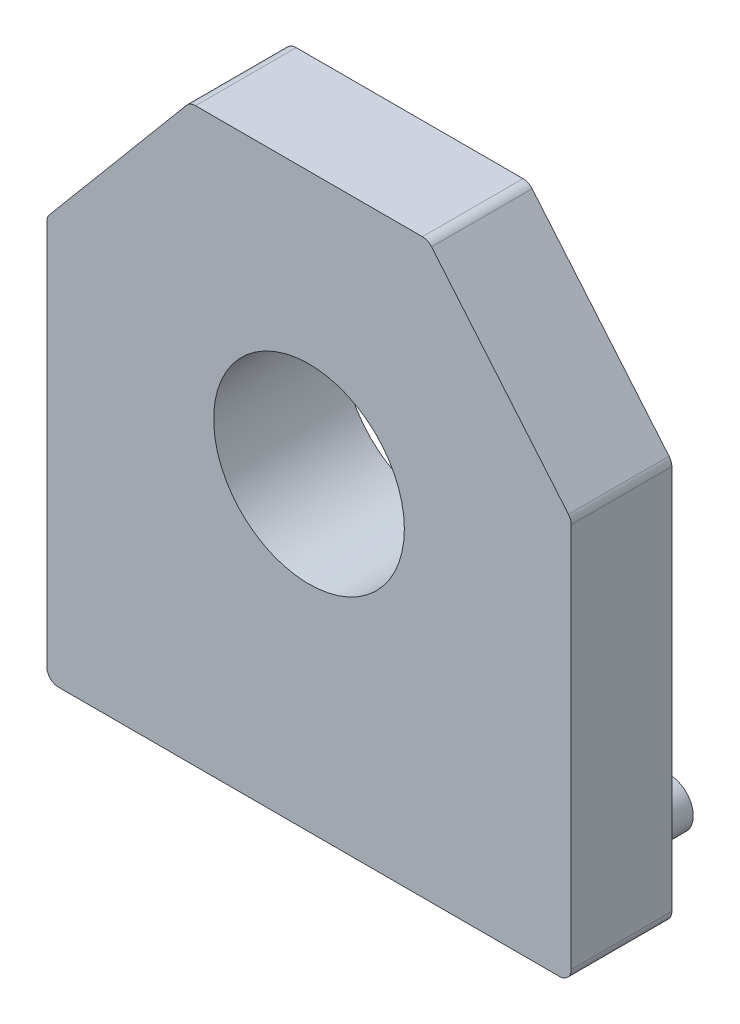
ISO-10303-21;
HEADER;
FILE_DESCRIPTION(('STEP AP214'),'2;1');
FILE_NAME('part.step','',(''),(''),'','','');
FILE_SCHEMA(('AUTOMOTIVE_DESIGN { 1 0 10303 214 1 1 1 1 }'));
ENDSEC;
DATA;
#1=APPLICATION_CONTEXT('core data for automotive mechanical design processes');
#2=APPLICATION_PROTOCOL_DEFINITION('international standard','automotive_design',2000,#1);
#3=PRODUCT_CONTEXT('',#1,'mechanical');
#4=PRODUCT('Part','Part','',(#3));
#5=PRODUCT_RELATED_PRODUCT_CATEGORY('part','',(#4));
#6=PRODUCT_DEFINITION_FORMATION('','',#4);
#7=PRODUCT_DEFINITION_CONTEXT('part definition',#1,'design');
#8=PRODUCT_DEFINITION('design','',#6,#7);
#9=PRODUCT_DEFINITION_SHAPE('','',#8);
#10=(LENGTH_UNIT() NAMED_UNIT(*) SI_UNIT(.MILLI.,.METRE.));
#11=(NAMED_UNIT(*) PLANE_ANGLE_UNIT() SI_UNIT($,.RADIAN.));
#12=(NAMED_UNIT(*) SI_UNIT($,.STERADIAN.) SOLID_ANGLE_UNIT());
#13=UNCERTAINTY_MEASURE_WITH_UNIT(LENGTH_MEASURE(1.E-05),#10,'distance_accuracy_value','');
#14=(GEOMETRIC_REPRESENTATION_CONTEXT(3) GLOBAL_UNCERTAINTY_ASSIGNED_CONTEXT((#13)) GLOBAL_UNIT_ASSIGNED_CONTEXT((#10,
#11,#12)) REPRESENTATION_CONTEXT('',''));
#15=CARTESIAN_POINT('',(0.,0.,0.));
#16=DIRECTION('',(0.,0.,1.));
#17=DIRECTION('',(1.,0.,0.));
#18=AXIS2_PLACEMENT_3D('',#15,#16,#17);
#19=CARTESIAN_POINT('',(0.,12.,0.));
#20=DIRECTION('',(0.,0.,-1.));
#21=DIRECTION('',(-1.,0.,0.));
#22=AXIS2_PLACEMENT_3D('',#19,#20,#21);
#23=PLANE('',#22);
#24=CARTESIAN_POINT('',(9.75,1.01,0.));
#25=DIRECTION('',(0.,0.,-1.));
#26=DIRECTION('',(-1.,0.,0.));
#27=AXIS2_PLACEMENT_3D('',#24,#25,#26);
#28=CIRCLE('',#27,0.500000000000001);
#29=CARTESIAN_POINT('',(9.25,1.01,0.));
#30=VERTEX_POINT('',#29);
#31=EDGE_CURVE('E248',#30,#30,#28,.T.);
#32=ORIENTED_EDGE('',*,*,#31,.F.);
#33=EDGE_LOOP('',(#32));
#34=FACE_BOUND('',#33,.T.);
#35=DIRECTION('',(1.,0.,0.));
#36=VECTOR('',#35,1.);
#37=CARTESIAN_POINT('',(0.,0.,0.));
#38=LINE('',#37,#36);
#39=CARTESIAN_POINT('',(0.25,0.,0.));
#40=VERTEX_POINT('',#39);
#41=CARTESIAN_POINT('',(10.75,0.,0.));
#42=VERTEX_POINT('',#41);
#43=EDGE_CURVE('E138',#40,#42,#38,.T.);
#44=ORIENTED_EDGE('',*,*,#43,.F.);
#45=CARTESIAN_POINT('',(0.25,0.25,0.));
#46=DIRECTION('',(0.,0.,-1.));
#47=DIRECTION('',(-1.,0.,0.));
#48=AXIS2_PLACEMENT_3D('',#45,#46,#47);
#49=CIRCLE('',#48,0.25);
#50=CARTESIAN_POINT('',(0.,0.25,0.));
#51=VERTEX_POINT('',#50);
#52=EDGE_CURVE('E121',#40,#51,#49,.T.);
#53=ORIENTED_EDGE('',*,*,#52,.T.);
#54=DIRECTION('',(0.,-1.,0.));
#55=VECTOR('',#54,1.);
#56=CARTESIAN_POINT('',(0.,0.,0.));
#57=LINE('',#56,#55);
#58=CARTESIAN_POINT('',(0.,8.32900744143345,0.));
#59=VERTEX_POINT('',#58);
#60=EDGE_CURVE('E149',#59,#51,#57,.T.);
#61=ORIENTED_EDGE('',*,*,#60,.F.);
#62=CARTESIAN_POINT('',(0.25,8.32900744143345,0.));
#63=DIRECTION('',(0.,0.,-1.));
#64=DIRECTION('',(-1.,0.,0.));
#65=AXIS2_PLACEMENT_3D('',#62,#63,#64);
#66=CIRCLE('',#65,0.25);
#67=CARTESIAN_POINT('',(0.0584888892202551,8.48970434385508,0.));
#68=VERTEX_POINT('',#67);
#69=EDGE_CURVE('E132',#59,#68,#66,.T.);
#70=ORIENTED_EDGE('',*,*,#69,.T.);
#71=DIRECTION('',(-0.64278760968654,-0.766044443118977,0.));
#72=VECTOR('',#71,1.);
#73=CARTESIAN_POINT('',(0.,8.42,0.));
#74=LINE('',#73,#72);
#75=CARTESIAN_POINT('',(2.92904248337368,11.9106969024216,0.));
#76=VERTEX_POINT('',#75);
#77=EDGE_CURVE('E163',#76,#68,#74,.T.);
#78=ORIENTED_EDGE('',*,*,#77,.F.);
#79=CARTESIAN_POINT('',(3.12055359415342,11.75,0.));
#80=DIRECTION('',(0.,0.,-1.));
#81=DIRECTION('',(-1.,0.,0.));
#82=AXIS2_PLACEMENT_3D('',#79,#80,#81);
#83=CIRCLE('',#82,0.25);
#84=CARTESIAN_POINT('',(3.12055359415342,12.,0.));
#85=VERTEX_POINT('',#84);
#86=EDGE_CURVE('E172',#76,#85,#83,.T.);
#87=ORIENTED_EDGE('',*,*,#86,.T.);
#88=DIRECTION('',(-1.,0.,0.));
#89=VECTOR('',#88,1.);
#90=CARTESIAN_POINT('',(3.00397667961467,12.,0.));
#91=LINE('',#90,#89);
#92=CARTESIAN_POINT('',(7.87944640584656,12.,0.));
#93=VERTEX_POINT('',#92);
#94=EDGE_CURVE('E160',#93,#85,#91,.T.);
#95=ORIENTED_EDGE('',*,*,#94,.F.);
#96=CARTESIAN_POINT('',(7.87944640584656,11.75,0.));
#97=DIRECTION('',(0.,0.,-1.));
#98=DIRECTION('',(-1.,0.,0.));
#99=AXIS2_PLACEMENT_3D('',#96,#97,#98);
#100=CIRCLE('',#99,0.25);
#101=CARTESIAN_POINT('',(8.07095751662631,11.9106969024216,0.));
#102=VERTEX_POINT('',#101);
#103=EDGE_CURVE('E142',#93,#102,#100,.T.);
#104=ORIENTED_EDGE('',*,*,#103,.T.);
#105=DIRECTION('',(-0.642787609686541,0.766044443118976,0.));
#106=VECTOR('',#105,1.);
#107=CARTESIAN_POINT('',(11.,8.42,0.));
#108=LINE('',#107,#106);
#109=CARTESIAN_POINT('',(10.9415111107797,8.48970434385508,0.));
#110=VERTEX_POINT('',#109);
#111=EDGE_CURVE('E152',#110,#102,#108,.T.);
#112=ORIENTED_EDGE('',*,*,#111,.F.);
#113=CARTESIAN_POINT('',(10.75,8.32900744143345,0.));
#114=DIRECTION('',(0.,0.,-1.));
#115=DIRECTION('',(-1.,0.,0.));
#116=AXIS2_PLACEMENT_3D('',#113,#114,#115);
#117=CIRCLE('',#116,0.25);
#118=CARTESIAN_POINT('',(11.,8.32900744143345,0.));
#119=VERTEX_POINT('',#118);
#120=EDGE_CURVE('E169',#110,#119,#117,.T.);
#121=ORIENTED_EDGE('',*,*,#120,.T.);
#122=DIRECTION('',(0.,1.,0.));
#123=VECTOR('',#122,1.);
#124=CARTESIAN_POINT('',(11.,0.,0.));
#125=LINE('',#124,#123);
#126=CARTESIAN_POINT('',(11.,0.25,0.));
#127=VERTEX_POINT('',#126);
#128=EDGE_CURVE('E148',#127,#119,#125,.T.);
#129=ORIENTED_EDGE('',*,*,#128,.F.);
#130=CARTESIAN_POINT('',(10.75,0.25,0.));
#131=DIRECTION('',(0.,0.,-1.));
#132=DIRECTION('',(-1.,0.,0.));
#133=AXIS2_PLACEMENT_3D('',#130,#131,#132);
#134=CIRCLE('',#133,0.25);
#135=EDGE_CURVE('E147',#127,#42,#134,.T.);
#136=ORIENTED_EDGE('',*,*,#135,.T.);
#137=EDGE_LOOP('',(#44,#53,#61,#70,#78,#87,#95,#104,#112,#121,#129,#136));
#138=FACE_BOUND('',#137,.T.);
#139=CARTESIAN_POINT('',(5.5,6.5,0.));
#140=DIRECTION('',(0.,0.,-1.));
#141=DIRECTION('',(-1.,0.,0.));
#142=AXIS2_PLACEMENT_3D('',#139,#140,#141);
#143=CIRCLE('',#142,2.5);
#144=CARTESIAN_POINT('',(3.,6.5,0.));
#145=VERTEX_POINT('',#144);
#146=EDGE_CURVE('E239',#145,#145,#143,.T.);
#147=ORIENTED_EDGE('',*,*,#146,.F.);
#148=EDGE_LOOP('',(#147));
#149=FACE_BOUND('',#148,.T.);
#150=CARTESIAN_POINT('',(1.25,1.01,0.));
#151=DIRECTION('',(0.,0.,-1.));
#152=DIRECTION('',(-1.,0.,0.));
#153=AXIS2_PLACEMENT_3D('',#150,#151,#152);
#154=CIRCLE('',#153,0.5);
#155=CARTESIAN_POINT('',(0.749999999999996,1.01,0.));
#156=VERTEX_POINT('',#155);
#157=EDGE_CURVE('E254',#156,#156,#154,.T.);
#158=ORIENTED_EDGE('',*,*,#157,.F.);
#159=EDGE_LOOP('',(#158));
#160=FACE_BOUND('',#159,.T.);
#161=ADVANCED_FACE('F30',(#34,#138,#149,#160),#23,.T.);
#162=CARTESIAN_POINT('',(0.,0.,2.11));
#163=DIRECTION('',(1.,0.,0.));
#164=DIRECTION('',(0.,0.,-1.));
#165=AXIS2_PLACEMENT_3D('',#162,#163,#164);
#166=PLANE('',#165);
#167=ORIENTED_EDGE('',*,*,#60,.T.);
#168=DIRECTION('',(0.,0.,-1.));
#169=VECTOR('',#168,1.);
#170=CARTESIAN_POINT('',(0.,0.25,2.11));
#171=LINE('',#170,#169);
#172=CARTESIAN_POINT('',(0.,0.25,2.11));
#173=VERTEX_POINT('',#172);
#174=EDGE_CURVE('E126',#51,#173,#171,.F.);
#175=ORIENTED_EDGE('',*,*,#174,.T.);
#176=DIRECTION('',(0.,-1.,0.));
#177=VECTOR('',#176,1.);
#178=CARTESIAN_POINT('',(0.,0.,2.11));
#179=LINE('',#178,#177);
#180=CARTESIAN_POINT('',(0.,8.32900744143345,2.11));
#181=VERTEX_POINT('',#180);
#182=EDGE_CURVE('E165',#181,#173,#179,.T.);
#183=ORIENTED_EDGE('',*,*,#182,.F.);
#184=DIRECTION('',(0.,0.,-1.));
#185=VECTOR('',#184,1.);
#186=CARTESIAN_POINT('',(0.,8.32900744143345,2.11));
#187=LINE('',#186,#185);
#188=EDGE_CURVE('E131',#181,#59,#187,.T.);
#189=ORIENTED_EDGE('',*,*,#188,.T.);
#190=EDGE_LOOP('',(#167,#175,#183,#189));
#191=FACE_BOUND('',#190,.T.);
#192=ADVANCED_FACE('F270',(#191),#166,.F.);
#193=CARTESIAN_POINT('',(0.,0.,2.11));
#194=DIRECTION('',(0.,1.,0.));
#195=DIRECTION('',(0.,0.,1.));
#196=AXIS2_PLACEMENT_3D('',#193,#194,#195);
#197=PLANE('',#196);
#198=DIRECTION('',(1.,0.,0.));
#199=VECTOR('',#198,1.);
#200=CARTESIAN_POINT('',(0.,0.,2.11));
#201=LINE('',#200,#199);
#202=CARTESIAN_POINT('',(0.25,0.,2.11));
#203=VERTEX_POINT('',#202);
#204=CARTESIAN_POINT('',(10.75,0.,2.11));
#205=VERTEX_POINT('',#204);
#206=EDGE_CURVE('E141',#203,#205,#201,.T.);
#207=ORIENTED_EDGE('',*,*,#206,.F.);
#208=DIRECTION('',(0.,0.,-1.));
#209=VECTOR('',#208,1.);
#210=CARTESIAN_POINT('',(0.25,0.,2.11));
#211=LINE('',#210,#209);
#212=EDGE_CURVE('E125',#203,#40,#211,.T.);
#213=ORIENTED_EDGE('',*,*,#212,.T.);
#214=ORIENTED_EDGE('',*,*,#43,.T.);
#215=DIRECTION('',(0.,0.,-1.));
#216=VECTOR('',#215,1.);
#217=CARTESIAN_POINT('',(10.75,0.,2.11));
#218=LINE('',#217,#216);
#219=EDGE_CURVE('E143',#42,#205,#218,.F.);
#220=ORIENTED_EDGE('',*,*,#219,.T.);
#221=EDGE_LOOP('',(#207,#213,#214,#220));
#222=FACE_BOUND('',#221,.T.);
#223=ADVANCED_FACE('F137',(#222),#197,.F.);
#224=CARTESIAN_POINT('',(11.,0.,2.11));
#225=DIRECTION('',(-1.,0.,0.));
#226=DIRECTION('',(0.,-1.,0.));
#227=AXIS2_PLACEMENT_3D('',#224,#225,#226);
#228=PLANE('',#227);
#229=DIRECTION('',(0.,1.,0.));
#230=VECTOR('',#229,1.);
#231=CARTESIAN_POINT('',(11.,0.,2.11));
#232=LINE('',#231,#230);
#233=CARTESIAN_POINT('',(11.,0.25,2.11));
#234=VERTEX_POINT('',#233);
#235=CARTESIAN_POINT('',(11.,8.32900744143345,2.11));
#236=VERTEX_POINT('',#235);
#237=EDGE_CURVE('E218',#234,#236,#232,.T.);
#238=ORIENTED_EDGE('',*,*,#237,.F.);
#239=DIRECTION('',(0.,0.,-1.));
#240=VECTOR('',#239,1.);
#241=CARTESIAN_POINT('',(11.,0.25,2.11));
#242=LINE('',#241,#240);
#243=EDGE_CURVE('E200',#234,#127,#242,.T.);
#244=ORIENTED_EDGE('',*,*,#243,.T.);
#245=ORIENTED_EDGE('',*,*,#128,.T.);
#246=DIRECTION('',(0.,0.,-1.));
#247=VECTOR('',#246,1.);
#248=CARTESIAN_POINT('',(11.,8.32900744143345,2.11));
#249=LINE('',#248,#247);
#250=EDGE_CURVE('E198',#119,#236,#249,.F.);
#251=ORIENTED_EDGE('',*,*,#250,.T.);
#252=EDGE_LOOP('',(#238,#244,#245,#251));
#253=FACE_BOUND('',#252,.T.);
#254=ADVANCED_FACE('F288',(#253),#228,.F.);
#255=CARTESIAN_POINT('',(11.,8.42,2.11));
#256=DIRECTION('',(-0.766044443118976,-0.642787609686542,0.));
#257=DIRECTION('',(0.642787609686542,-0.766044443118976,0.));
#258=AXIS2_PLACEMENT_3D('',#255,#256,#257);
#259=PLANE('',#258);
#260=DIRECTION('',(-0.642787609686541,0.766044443118976,0.));
#261=VECTOR('',#260,1.);
#262=CARTESIAN_POINT('',(11.,8.42,2.11));
#263=LINE('',#262,#261);
#264=CARTESIAN_POINT('',(10.9415111107797,8.48970434385508,2.11));
#265=VERTEX_POINT('',#264);
#266=CARTESIAN_POINT('',(8.07095751662631,11.9106969024216,2.11));
#267=VERTEX_POINT('',#266);
#268=EDGE_CURVE('E207',#265,#267,#263,.T.);
#269=ORIENTED_EDGE('',*,*,#268,.F.);
#270=DIRECTION('',(0.,0.,-1.));
#271=VECTOR('',#270,1.);
#272=CARTESIAN_POINT('',(10.9415111107797,8.48970434385508,2.11));
#273=LINE('',#272,#271);
#274=EDGE_CURVE('E11',#265,#110,#273,.T.);
#275=ORIENTED_EDGE('',*,*,#274,.T.);
#276=ORIENTED_EDGE('',*,*,#111,.T.);
#277=DIRECTION('',(0.,0.,-1.));
#278=VECTOR('',#277,1.);
#279=CARTESIAN_POINT('',(8.07095751662631,11.9106969024216,2.11));
#280=LINE('',#279,#278);
#281=EDGE_CURVE('E38',#102,#267,#280,.F.);
#282=ORIENTED_EDGE('',*,*,#281,.T.);
#283=EDGE_LOOP('',(#269,#275,#276,#282));
#284=FACE_BOUND('',#283,.T.);
#285=ADVANCED_FACE('F206',(#284),#259,.F.);
#286=CARTESIAN_POINT('',(3.00397667961467,12.,2.11));
#287=DIRECTION('',(0.,-1.,0.));
#288=DIRECTION('',(0.,0.,-1.));
#289=AXIS2_PLACEMENT_3D('',#286,#287,#288);
#290=PLANE('',#289);
#291=ORIENTED_EDGE('',*,*,#94,.T.);
#292=DIRECTION('',(0.,0.,-1.));
#293=VECTOR('',#292,1.);
#294=CARTESIAN_POINT('',(3.12055359415342,12.,2.11));
#295=LINE('',#294,#293);
#296=CARTESIAN_POINT('',(3.12055359415342,12.,2.11));
#297=VERTEX_POINT('',#296);
#298=EDGE_CURVE('E196',#85,#297,#295,.F.);
#299=ORIENTED_EDGE('',*,*,#298,.T.);
#300=DIRECTION('',(-1.,0.,0.));
#301=VECTOR('',#300,1.);
#302=CARTESIAN_POINT('',(3.00397667961467,12.,2.11));
#303=LINE('',#302,#301);
#304=CARTESIAN_POINT('',(7.87944640584656,12.,2.11));
#305=VERTEX_POINT('',#304);
#306=EDGE_CURVE('E217',#305,#297,#303,.T.);
#307=ORIENTED_EDGE('',*,*,#306,.F.);
#308=DIRECTION('',(0.,0.,-1.));
#309=VECTOR('',#308,1.);
#310=CARTESIAN_POINT('',(7.87944640584656,12.,2.11));
#311=LINE('',#310,#309);
#312=EDGE_CURVE('E193',#305,#93,#311,.T.);
#313=ORIENTED_EDGE('',*,*,#312,.T.);
#314=EDGE_LOOP('',(#291,#299,#307,#313));
#315=FACE_BOUND('',#314,.T.);
#316=ADVANCED_FACE('F223',(#315),#290,.F.);
#317=CARTESIAN_POINT('',(0.,8.42,2.11));
#318=DIRECTION('',(0.766044443118977,-0.64278760968654,0.));
#319=DIRECTION('',(0.64278760968654,0.766044443118977,0.));
#320=AXIS2_PLACEMENT_3D('',#317,#318,#319);
#321=PLANE('',#320);
#322=ORIENTED_EDGE('',*,*,#77,.T.);
#323=DIRECTION('',(0.,0.,-1.));
#324=VECTOR('',#323,1.);
#325=CARTESIAN_POINT('',(0.0584888892202551,8.48970434385508,2.11));
#326=LINE('',#325,#324);
#327=CARTESIAN_POINT('',(0.0584888892202551,8.48970434385508,2.11));
#328=VERTEX_POINT('',#327);
#329=EDGE_CURVE('E45',#68,#328,#326,.F.);
#330=ORIENTED_EDGE('',*,*,#329,.T.);
#331=DIRECTION('',(-0.64278760968654,-0.766044443118977,0.));
#332=VECTOR('',#331,1.);
#333=CARTESIAN_POINT('',(0.,8.42,2.11));
#334=LINE('',#333,#332);
#335=CARTESIAN_POINT('',(2.92904248337368,11.9106969024216,2.11));
#336=VERTEX_POINT('',#335);
#337=EDGE_CURVE('E166',#336,#328,#334,.T.);
#338=ORIENTED_EDGE('',*,*,#337,.F.);
#339=DIRECTION('',(0.,0.,-1.));
#340=VECTOR('',#339,1.);
#341=CARTESIAN_POINT('',(2.92904248337368,11.9106969024216,2.11));
#342=LINE('',#341,#340);
#343=EDGE_CURVE('E189',#336,#76,#342,.T.);
#344=ORIENTED_EDGE('',*,*,#343,.T.);
#345=EDGE_LOOP('',(#322,#330,#338,#344));
#346=FACE_BOUND('',#345,.T.);
#347=ADVANCED_FACE('F229',(#346),#321,.F.);
#348=CARTESIAN_POINT('',(0.,12.,2.11));
#349=DIRECTION('',(0.,0.,-1.));
#350=DIRECTION('',(-1.,0.,0.));
#351=AXIS2_PLACEMENT_3D('',#348,#349,#350);
#352=PLANE('',#351);
#353=CARTESIAN_POINT('',(5.5,6.5,2.11));
#354=DIRECTION('',(0.,0.,1.));
#355=DIRECTION('',(1.,0.,0.));
#356=AXIS2_PLACEMENT_3D('',#353,#354,#355);
#357=CIRCLE('',#356,2.);
#358=CARTESIAN_POINT('',(7.5,6.5,2.11));
#359=VERTEX_POINT('',#358);
#360=EDGE_CURVE('E154',#359,#359,#357,.T.);
#361=ORIENTED_EDGE('',*,*,#360,.F.);
#362=EDGE_LOOP('',(#361));
#363=FACE_BOUND('',#362,.T.);
#364=ORIENTED_EDGE('',*,*,#182,.T.);
#365=CARTESIAN_POINT('',(0.25,0.25,2.11));
#366=DIRECTION('',(0.,0.,-1.));
#367=DIRECTION('',(-1.,0.,0.));
#368=AXIS2_PLACEMENT_3D('',#365,#366,#367);
#369=CIRCLE('',#368,0.25);
#370=EDGE_CURVE('E187',#173,#203,#369,.F.);
#371=ORIENTED_EDGE('',*,*,#370,.T.);
#372=ORIENTED_EDGE('',*,*,#206,.T.);
#373=CARTESIAN_POINT('',(10.75,0.25,2.11));
#374=DIRECTION('',(0.,0.,-1.));
#375=DIRECTION('',(-1.,0.,0.));
#376=AXIS2_PLACEMENT_3D('',#373,#374,#375);
#377=CIRCLE('',#376,0.25);
#378=EDGE_CURVE('E182',#205,#234,#377,.F.);
#379=ORIENTED_EDGE('',*,*,#378,.T.);
#380=ORIENTED_EDGE('',*,*,#237,.T.);
#381=CARTESIAN_POINT('',(10.75,8.32900744143345,2.11));
#382=DIRECTION('',(0.,0.,-1.));
#383=DIRECTION('',(-1.,0.,0.));
#384=AXIS2_PLACEMENT_3D('',#381,#382,#383);
#385=CIRCLE('',#384,0.25);
#386=EDGE_CURVE('E180',#236,#265,#385,.F.);
#387=ORIENTED_EDGE('',*,*,#386,.T.);
#388=ORIENTED_EDGE('',*,*,#268,.T.);
#389=CARTESIAN_POINT('',(7.87944640584656,11.75,2.11));
#390=DIRECTION('',(0.,0.,-1.));
#391=DIRECTION('',(-1.,0.,0.));
#392=AXIS2_PLACEMENT_3D('',#389,#390,#391);
#393=CIRCLE('',#392,0.25);
#394=EDGE_CURVE('E178',#267,#305,#393,.F.);
#395=ORIENTED_EDGE('',*,*,#394,.T.);
#396=ORIENTED_EDGE('',*,*,#306,.T.);
#397=CARTESIAN_POINT('',(3.12055359415342,11.75,2.11));
#398=DIRECTION('',(0.,0.,-1.));
#399=DIRECTION('',(-1.,0.,0.));
#400=AXIS2_PLACEMENT_3D('',#397,#398,#399);
#401=CIRCLE('',#400,0.25);
#402=EDGE_CURVE('E52',#297,#336,#401,.F.);
#403=ORIENTED_EDGE('',*,*,#402,.T.);
#404=ORIENTED_EDGE('',*,*,#337,.T.);
#405=CARTESIAN_POINT('',(0.25,8.32900744143345,2.11));
#406=DIRECTION('',(0.,0.,-1.));
#407=DIRECTION('',(-1.,0.,0.));
#408=AXIS2_PLACEMENT_3D('',#405,#406,#407);
#409=CIRCLE('',#408,0.25);
#410=EDGE_CURVE('E185',#328,#181,#409,.F.);
#411=ORIENTED_EDGE('',*,*,#410,.T.);
#412=EDGE_LOOP('',(#364,#371,#372,#379,#380,#387,#388,#395,#396,#403,#404,#411));
#413=FACE_BOUND('',#412,.T.);
#414=ADVANCED_FACE('F213',(#363,#413),#352,.F.);
#415=CARTESIAN_POINT('',(0.25,0.25,2.11));
#416=DIRECTION('',(0.,0.,-1.));
#417=DIRECTION('',(-1.,0.,0.));
#418=AXIS2_PLACEMENT_3D('',#415,#416,#417);
#419=CYLINDRICAL_SURFACE('',#418,0.25);
#420=ORIENTED_EDGE('',*,*,#370,.F.);
#421=ORIENTED_EDGE('',*,*,#174,.F.);
#422=ORIENTED_EDGE('',*,*,#52,.F.);
#423=ORIENTED_EDGE('',*,*,#212,.F.);
#424=EDGE_LOOP('',(#420,#421,#422,#423));
#425=FACE_BOUND('',#424,.T.);
#426=ADVANCED_FACE('F124',(#425),#419,.T.);
#427=CARTESIAN_POINT('',(0.25,8.32900744143345,2.11));
#428=DIRECTION('',(0.,0.,-1.));
#429=DIRECTION('',(-1.,0.,0.));
#430=AXIS2_PLACEMENT_3D('',#427,#428,#429);
#431=CYLINDRICAL_SURFACE('',#430,0.25);
#432=ORIENTED_EDGE('',*,*,#410,.F.);
#433=ORIENTED_EDGE('',*,*,#329,.F.);
#434=ORIENTED_EDGE('',*,*,#69,.F.);
#435=ORIENTED_EDGE('',*,*,#188,.F.);
#436=EDGE_LOOP('',(#432,#433,#434,#435));
#437=FACE_BOUND('',#436,.T.);
#438=ADVANCED_FACE('F296',(#437),#431,.T.);
#439=CARTESIAN_POINT('',(3.12055359415342,11.75,2.11));
#440=DIRECTION('',(0.,0.,-1.));
#441=DIRECTION('',(-1.,0.,0.));
#442=AXIS2_PLACEMENT_3D('',#439,#440,#441);
#443=CYLINDRICAL_SURFACE('',#442,0.25);
#444=ORIENTED_EDGE('',*,*,#402,.F.);
#445=ORIENTED_EDGE('',*,*,#298,.F.);
#446=ORIENTED_EDGE('',*,*,#86,.F.);
#447=ORIENTED_EDGE('',*,*,#343,.F.);
#448=EDGE_LOOP('',(#444,#445,#446,#447));
#449=FACE_BOUND('',#448,.T.);
#450=ADVANCED_FACE('F228',(#449),#443,.T.);
#451=CARTESIAN_POINT('',(10.75,0.25,2.11));
#452=DIRECTION('',(0.,0.,-1.));
#453=DIRECTION('',(-1.,0.,0.));
#454=AXIS2_PLACEMENT_3D('',#451,#452,#453);
#455=CYLINDRICAL_SURFACE('',#454,0.25);
#456=ORIENTED_EDGE('',*,*,#378,.F.);
#457=ORIENTED_EDGE('',*,*,#219,.F.);
#458=ORIENTED_EDGE('',*,*,#135,.F.);
#459=ORIENTED_EDGE('',*,*,#243,.F.);
#460=EDGE_LOOP('',(#456,#457,#458,#459));
#461=FACE_BOUND('',#460,.T.);
#462=ADVANCED_FACE('F302',(#461),#455,.T.);
#463=CARTESIAN_POINT('',(10.75,8.32900744143345,2.11));
#464=DIRECTION('',(0.,0.,-1.));
#465=DIRECTION('',(-1.,0.,0.));
#466=AXIS2_PLACEMENT_3D('',#463,#464,#465);
#467=CYLINDRICAL_SURFACE('',#466,0.25);
#468=ORIENTED_EDGE('',*,*,#386,.F.);
#469=ORIENTED_EDGE('',*,*,#250,.F.);
#470=ORIENTED_EDGE('',*,*,#120,.F.);
#471=ORIENTED_EDGE('',*,*,#274,.F.);
#472=EDGE_LOOP('',(#468,#469,#470,#471));
#473=FACE_BOUND('',#472,.T.);
#474=ADVANCED_FACE('F304',(#473),#467,.T.);
#475=CARTESIAN_POINT('',(7.87944640584656,11.75,2.11));
#476=DIRECTION('',(0.,0.,-1.));
#477=DIRECTION('',(-1.,0.,0.));
#478=AXIS2_PLACEMENT_3D('',#475,#476,#477);
#479=CYLINDRICAL_SURFACE('',#478,0.25);
#480=ORIENTED_EDGE('',*,*,#394,.F.);
#481=ORIENTED_EDGE('',*,*,#281,.F.);
#482=ORIENTED_EDGE('',*,*,#103,.F.);
#483=ORIENTED_EDGE('',*,*,#312,.F.);
#484=EDGE_LOOP('',(#480,#481,#482,#483));
#485=FACE_BOUND('',#484,.T.);
#486=ADVANCED_FACE('F32',(#485),#479,.T.);
#487=CARTESIAN_POINT('',(5.5,6.5,0.));
#488=DIRECTION('',(0.,0.,1.));
#489=DIRECTION('',(1.,0.,0.));
#490=AXIS2_PLACEMENT_3D('',#487,#488,#489);
#491=CYLINDRICAL_SURFACE('',#490,2.);
#492=ORIENTED_EDGE('',*,*,#360,.T.);
#493=EDGE_LOOP('',(#492));
#494=FACE_BOUND('',#493,.T.);
#495=CARTESIAN_POINT('',(5.5,6.5,-0.6));
#496=DIRECTION('',(0.,0.,-1.));
#497=DIRECTION('',(-1.,0.,0.));
#498=AXIS2_PLACEMENT_3D('',#495,#496,#497);
#499=CIRCLE('',#498,2.);
#500=CARTESIAN_POINT('',(3.5,6.5,-0.6));
#501=VERTEX_POINT('',#500);
#502=EDGE_CURVE('E242',#501,#501,#499,.T.);
#503=ORIENTED_EDGE('',*,*,#502,.T.);
#504=EDGE_LOOP('',(#503));
#505=FACE_BOUND('',#504,.T.);
#506=ADVANCED_FACE('F311',(#494,#505),#491,.F.);
#507=CARTESIAN_POINT('',(5.5,6.5,-0.6));
#508=DIRECTION('',(0.,0.,-1.));
#509=DIRECTION('',(-1.,0.,0.));
#510=AXIS2_PLACEMENT_3D('',#507,#508,#509);
#511=PLANE('',#510);
#512=CARTESIAN_POINT('',(5.5,6.5,-0.6));
#513=DIRECTION('',(0.,0.,-1.));
#514=DIRECTION('',(-1.,0.,0.));
#515=AXIS2_PLACEMENT_3D('',#512,#513,#514);
#516=CIRCLE('',#515,2.5);
#517=CARTESIAN_POINT('',(3.,6.5,-0.6));
#518=VERTEX_POINT('',#517);
#519=EDGE_CURVE('E238',#518,#518,#516,.T.);
#520=ORIENTED_EDGE('',*,*,#519,.T.);
#521=EDGE_LOOP('',(#520));
#522=FACE_BOUND('',#521,.T.);
#523=ORIENTED_EDGE('',*,*,#502,.F.);
#524=EDGE_LOOP('',(#523));
#525=FACE_BOUND('',#524,.T.);
#526=ADVANCED_FACE('F321',(#522,#525),#511,.T.);
#527=CARTESIAN_POINT('',(5.5,6.5,-0.6));
#528=DIRECTION('',(0.,0.,1.));
#529=DIRECTION('',(1.,0.,0.));
#530=AXIS2_PLACEMENT_3D('',#527,#528,#529);
#531=CYLINDRICAL_SURFACE('',#530,2.5);
#532=ORIENTED_EDGE('',*,*,#519,.F.);
#533=EDGE_LOOP('',(#532));
#534=FACE_BOUND('',#533,.T.);
#535=ORIENTED_EDGE('',*,*,#146,.T.);
#536=EDGE_LOOP('',(#535));
#537=FACE_BOUND('',#536,.T.);
#538=ADVANCED_FACE('F326',(#534,#537),#531,.T.);
#539=CARTESIAN_POINT('',(9.75,1.01,-1.2));
#540=DIRECTION('',(0.,0.,1.));
#541=DIRECTION('',(1.,0.,0.));
#542=AXIS2_PLACEMENT_3D('',#539,#540,#541);
#543=CYLINDRICAL_SURFACE('',#542,0.500000000000001);
#544=CARTESIAN_POINT('',(9.75,1.01,-1.2));
#545=DIRECTION('',(0.,0.,-1.));
#546=DIRECTION('',(-1.,0.,0.));
#547=AXIS2_PLACEMENT_3D('',#544,#545,#546);
#548=CIRCLE('',#547,0.500000000000001);
#549=CARTESIAN_POINT('',(9.25,1.01,-1.2));
#550=VERTEX_POINT('',#549);
#551=EDGE_CURVE('E247',#550,#550,#548,.T.);
#552=ORIENTED_EDGE('',*,*,#551,.F.);
#553=EDGE_LOOP('',(#552));
#554=FACE_BOUND('',#553,.T.);
#555=ORIENTED_EDGE('',*,*,#31,.T.);
#556=EDGE_LOOP('',(#555));
#557=FACE_BOUND('',#556,.T.);
#558=ADVANCED_FACE('F332',(#554,#557),#543,.T.);
#559=CARTESIAN_POINT('',(9.75,1.01,-1.2));
#560=DIRECTION('',(0.,0.,-1.));
#561=DIRECTION('',(-1.,0.,0.));
#562=AXIS2_PLACEMENT_3D('',#559,#560,#561);
#563=PLANE('',#562);
#564=ORIENTED_EDGE('',*,*,#551,.T.);
#565=EDGE_LOOP('',(#564));
#566=FACE_BOUND('',#565,.T.);
#567=ADVANCED_FACE('F265',(#566),#563,.T.);
#568=CARTESIAN_POINT('',(1.25,1.01,-1.2));
#569=DIRECTION('',(0.,0.,1.));
#570=DIRECTION('',(1.,0.,0.));
#571=AXIS2_PLACEMENT_3D('',#568,#569,#570);
#572=CYLINDRICAL_SURFACE('',#571,0.5);
#573=CARTESIAN_POINT('',(1.25,1.01,-1.2));
#574=DIRECTION('',(0.,0.,-1.));
#575=DIRECTION('',(-1.,0.,0.));
#576=AXIS2_PLACEMENT_3D('',#573,#574,#575);
#577=CIRCLE('',#576,0.5);
#578=CARTESIAN_POINT('',(0.749999999999996,1.01,-1.2));
#579=VERTEX_POINT('',#578);
#580=EDGE_CURVE('E251',#579,#579,#577,.T.);
#581=ORIENTED_EDGE('',*,*,#580,.F.);
#582=EDGE_LOOP('',(#581));
#583=FACE_BOUND('',#582,.T.);
#584=ORIENTED_EDGE('',*,*,#157,.T.);
#585=EDGE_LOOP('',(#584));
#586=FACE_BOUND('',#585,.T.);
#587=ADVANCED_FACE('F262',(#583,#586),#572,.T.);
#588=CARTESIAN_POINT('',(1.25,1.01,-1.2));
#589=DIRECTION('',(0.,0.,-1.));
#590=DIRECTION('',(-1.,0.,0.));
#591=AXIS2_PLACEMENT_3D('',#588,#589,#590);
#592=PLANE('',#591);
#593=ORIENTED_EDGE('',*,*,#580,.T.);
#594=EDGE_LOOP('',(#593));
#595=FACE_BOUND('',#594,.T.);
#596=ADVANCED_FACE('F260',(#595),#592,.T.);
#597=CLOSED_SHELL('',(#161,#192,#223,#254,#285,#316,#347,#414,#426,#438,#450,#462,#474,#486,
#506,#526,#538,#558,#567,#587,#596));
#598=MANIFOLD_SOLID_BREP('B2',#597);
#599=ADVANCED_BREP_SHAPE_REPRESENTATION('',(#18,#598),#14);
#600=SHAPE_DEFINITION_REPRESENTATION(#9,#599);
ENDSEC;
END-ISO-10303-21;
